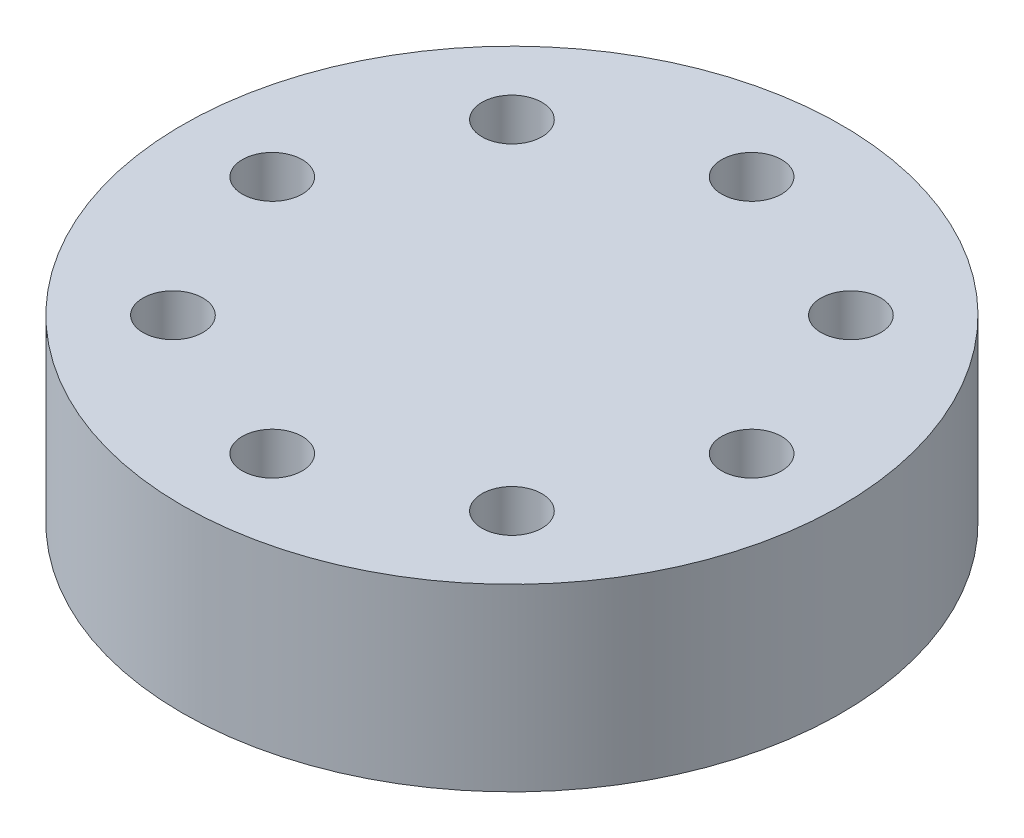
ISO-10303-21;
HEADER;
FILE_DESCRIPTION(('STEP AP214'),'2;1');
FILE_NAME('part.step','',(''),(''),'','','');
FILE_SCHEMA(('AUTOMOTIVE_DESIGN { 1 0 10303 214 1 1 1 1 }'));
ENDSEC;
DATA;
#1=APPLICATION_CONTEXT('core data for automotive mechanical design processes');
#2=APPLICATION_PROTOCOL_DEFINITION('international standard','automotive_design',2000,#1);
#3=PRODUCT_CONTEXT('',#1,'mechanical');
#4=PRODUCT('Part','Part','',(#3));
#5=PRODUCT_RELATED_PRODUCT_CATEGORY('part','',(#4));
#6=PRODUCT_DEFINITION_FORMATION('','',#4);
#7=PRODUCT_DEFINITION_CONTEXT('part definition',#1,'design');
#8=PRODUCT_DEFINITION('design','',#6,#7);
#9=PRODUCT_DEFINITION_SHAPE('','',#8);
#10=(LENGTH_UNIT() NAMED_UNIT(*) SI_UNIT(.MILLI.,.METRE.));
#11=(NAMED_UNIT(*) PLANE_ANGLE_UNIT() SI_UNIT($,.RADIAN.));
#12=(NAMED_UNIT(*) SI_UNIT($,.STERADIAN.) SOLID_ANGLE_UNIT());
#13=UNCERTAINTY_MEASURE_WITH_UNIT(LENGTH_MEASURE(1.E-05),#10,'distance_accuracy_value','');
#14=(GEOMETRIC_REPRESENTATION_CONTEXT(3) GLOBAL_UNCERTAINTY_ASSIGNED_CONTEXT((#13)) GLOBAL_UNIT_ASSIGNED_CONTEXT((#10,
#11,#12)) REPRESENTATION_CONTEXT('',''));
#15=CARTESIAN_POINT('',(0.,0.,0.));
#16=DIRECTION('',(0.,0.,1.));
#17=DIRECTION('',(1.,0.,0.));
#18=AXIS2_PLACEMENT_3D('',#15,#16,#17);
#19=CARTESIAN_POINT('',(0.,6.,0.));
#20=DIRECTION('',(0.,1.,0.));
#21=DIRECTION('',(0.,0.,1.));
#22=AXIS2_PLACEMENT_3D('',#19,#20,#21);
#23=PLANE('',#22);
#24=CARTESIAN_POINT('',(-7.99999999999966,6.,3.40570654445189E-13));
#25=DIRECTION('',(0.,1.,0.));
#26=DIRECTION('',(0.,0.,1.));
#27=AXIS2_PLACEMENT_3D('',#24,#25,#26);
#28=CIRCLE('',#27,1.0000000000005);
#29=CARTESIAN_POINT('',(-7.99999999999966,6.,1.00000000000085));
#30=VERTEX_POINT('',#29);
#31=EDGE_CURVE('E100',#30,#30,#28,.T.);
#32=ORIENTED_EDGE('',*,*,#31,.F.);
#33=EDGE_LOOP('',(#32));
#34=FACE_BOUND('',#33,.T.);
#35=CARTESIAN_POINT('',(6.79181874011743E-13,6.,8.));
#36=DIRECTION('',(0.,1.,0.));
#37=DIRECTION('',(0.,0.,1.));
#38=AXIS2_PLACEMENT_3D('',#35,#36,#37);
#39=CIRCLE('',#38,1.0000000000007);
#40=CARTESIAN_POINT('',(6.79181874011743E-13,6.,9.0000000000007));
#41=VERTEX_POINT('',#40);
#42=EDGE_CURVE('E84',#41,#41,#39,.T.);
#43=ORIENTED_EDGE('',*,*,#42,.F.);
#44=EDGE_LOOP('',(#43));
#45=FACE_BOUND('',#44,.T.);
#46=CARTESIAN_POINT('',(8.00000000000034,6.,-3.39590937005871E-13));
#47=DIRECTION('',(0.,1.,0.));
#48=DIRECTION('',(0.,0.,1.));
#49=AXIS2_PLACEMENT_3D('',#46,#47,#48);
#50=CIRCLE('',#49,1.00000000000025);
#51=CARTESIAN_POINT('',(8.00000000000034,6.,0.999999999999913));
#52=VERTEX_POINT('',#51);
#53=EDGE_CURVE('E68',#52,#52,#50,.T.);
#54=ORIENTED_EDGE('',*,*,#53,.F.);
#55=EDGE_LOOP('',(#54));
#56=FACE_BOUND('',#55,.T.);
#57=CARTESIAN_POINT('',(0.,6.,-8.));
#58=DIRECTION('',(0.,1.,0.));
#59=DIRECTION('',(0.,0.,1.));
#60=AXIS2_PLACEMENT_3D('',#57,#58,#59);
#61=CIRCLE('',#60,1.);
#62=CARTESIAN_POINT('',(0.,6.,-7.));
#63=VERTEX_POINT('',#62);
#64=EDGE_CURVE('E54',#63,#63,#61,.T.);
#65=ORIENTED_EDGE('',*,*,#64,.F.);
#66=EDGE_LOOP('',(#65));
#67=FACE_BOUND('',#66,.T.);
#68=CARTESIAN_POINT('',(0.,6.,0.));
#69=DIRECTION('',(0.,1.,0.));
#70=DIRECTION('',(0.,0.,1.));
#71=AXIS2_PLACEMENT_3D('',#68,#69,#70);
#72=CIRCLE('',#71,11.);
#73=CARTESIAN_POINT('',(0.,6.,11.));
#74=VERTEX_POINT('',#73);
#75=EDGE_CURVE('E10',#74,#74,#72,.T.);
#76=ORIENTED_EDGE('',*,*,#75,.T.);
#77=EDGE_LOOP('',(#76));
#78=FACE_BOUND('',#77,.T.);
#79=CARTESIAN_POINT('',(5.65685424949248,6.,-5.65685424949262));
#80=DIRECTION('',(0.,1.,0.));
#81=DIRECTION('',(0.,0.,1.));
#82=AXIS2_PLACEMENT_3D('',#79,#80,#81);
#83=CIRCLE('',#82,1.00000000000004);
#84=CARTESIAN_POINT('',(5.65685424949248,6.,-4.65685424949258));
#85=VERTEX_POINT('',#84);
#86=EDGE_CURVE('E60',#85,#85,#83,.T.);
#87=ORIENTED_EDGE('',*,*,#86,.F.);
#88=EDGE_LOOP('',(#87));
#89=FACE_BOUND('',#88,.T.);
#90=CARTESIAN_POINT('',(5.65685424949296,6.,5.65685424949214));
#91=DIRECTION('',(0.,1.,0.));
#92=DIRECTION('',(0.,0.,1.));
#93=AXIS2_PLACEMENT_3D('',#90,#91,#92);
#94=CIRCLE('',#93,1.00000000000052);
#95=CARTESIAN_POINT('',(5.65685424949296,6.,6.65685424949266));
#96=VERTEX_POINT('',#95);
#97=EDGE_CURVE('E76',#96,#96,#94,.T.);
#98=ORIENTED_EDGE('',*,*,#97,.F.);
#99=EDGE_LOOP('',(#98));
#100=FACE_BOUND('',#99,.T.);
#101=CARTESIAN_POINT('',(-5.6568542494918,6.,5.65685424949262));
#102=DIRECTION('',(0.,1.,0.));
#103=DIRECTION('',(0.,0.,1.));
#104=AXIS2_PLACEMENT_3D('',#101,#102,#103);
#105=CIRCLE('',#104,1.00000000000069);
#106=CARTESIAN_POINT('',(-5.6568542494918,6.,6.65685424949331));
#107=VERTEX_POINT('',#106);
#108=EDGE_CURVE('E92',#107,#107,#105,.T.);
#109=ORIENTED_EDGE('',*,*,#108,.F.);
#110=EDGE_LOOP('',(#109));
#111=FACE_BOUND('',#110,.T.);
#112=CARTESIAN_POINT('',(-5.65685424949228,6.,-5.65685424949214));
#113=DIRECTION('',(0.,1.,0.));
#114=DIRECTION('',(0.,0.,1.));
#115=AXIS2_PLACEMENT_3D('',#112,#113,#114);
#116=CIRCLE('',#115,1.00000000000026);
#117=CARTESIAN_POINT('',(-5.65685424949228,6.,-4.65685424949188));
#118=VERTEX_POINT('',#117);
#119=EDGE_CURVE('E108',#118,#118,#116,.T.);
#120=ORIENTED_EDGE('',*,*,#119,.F.);
#121=EDGE_LOOP('',(#120));
#122=FACE_BOUND('',#121,.T.);
#123=ADVANCED_FACE('F41',(#34,#45,#56,#67,#78,#89,#100,#111,#122),#23,.T.);
#124=CARTESIAN_POINT('',(0.,0.,0.));
#125=DIRECTION('',(0.,1.,0.));
#126=DIRECTION('',(0.,0.,1.));
#127=AXIS2_PLACEMENT_3D('',#124,#125,#126);
#128=PLANE('',#127);
#129=CARTESIAN_POINT('',(0.,0.,0.));
#130=DIRECTION('',(0.,-1.,0.));
#131=DIRECTION('',(0.,0.,-1.));
#132=AXIS2_PLACEMENT_3D('',#129,#130,#131);
#133=CIRCLE('',#132,4.);
#134=CARTESIAN_POINT('',(0.,0.,-4.));
#135=VERTEX_POINT('',#134);
#136=EDGE_CURVE('E120',#135,#135,#133,.T.);
#137=ORIENTED_EDGE('',*,*,#136,.F.);
#138=EDGE_LOOP('',(#137));
#139=FACE_BOUND('',#138,.T.);
#140=CARTESIAN_POINT('',(0.,0.,0.));
#141=DIRECTION('',(0.,1.,0.));
#142=DIRECTION('',(0.,0.,1.));
#143=AXIS2_PLACEMENT_3D('',#140,#141,#142);
#144=CIRCLE('',#143,11.);
#145=CARTESIAN_POINT('',(0.,0.,11.));
#146=VERTEX_POINT('',#145);
#147=EDGE_CURVE('E45',#146,#146,#144,.T.);
#148=ORIENTED_EDGE('',*,*,#147,.F.);
#149=EDGE_LOOP('',(#148));
#150=FACE_BOUND('',#149,.T.);
#151=CARTESIAN_POINT('',(0.,0.,-8.));
#152=DIRECTION('',(0.,1.,0.));
#153=DIRECTION('',(0.,0.,1.));
#154=AXIS2_PLACEMENT_3D('',#151,#152,#153);
#155=CIRCLE('',#154,1.);
#156=CARTESIAN_POINT('',(0.,0.,-7.));
#157=VERTEX_POINT('',#156);
#158=EDGE_CURVE('E56',#157,#157,#155,.T.);
#159=ORIENTED_EDGE('',*,*,#158,.T.);
#160=EDGE_LOOP('',(#159));
#161=FACE_BOUND('',#160,.T.);
#162=CARTESIAN_POINT('',(5.65685424949248,0.,-5.65685424949262));
#163=DIRECTION('',(0.,1.,0.));
#164=DIRECTION('',(0.,0.,1.));
#165=AXIS2_PLACEMENT_3D('',#162,#163,#164);
#166=CIRCLE('',#165,1.00000000000004);
#167=CARTESIAN_POINT('',(5.65685424949248,0.,-4.65685424949258));
#168=VERTEX_POINT('',#167);
#169=EDGE_CURVE('E64',#168,#168,#166,.T.);
#170=ORIENTED_EDGE('',*,*,#169,.T.);
#171=EDGE_LOOP('',(#170));
#172=FACE_BOUND('',#171,.T.);
#173=CARTESIAN_POINT('',(8.00000000000034,0.,-3.39590937005871E-13));
#174=DIRECTION('',(0.,1.,0.));
#175=DIRECTION('',(0.,0.,1.));
#176=AXIS2_PLACEMENT_3D('',#173,#174,#175);
#177=CIRCLE('',#176,1.00000000000025);
#178=CARTESIAN_POINT('',(8.00000000000034,0.,0.999999999999913));
#179=VERTEX_POINT('',#178);
#180=EDGE_CURVE('E72',#179,#179,#177,.T.);
#181=ORIENTED_EDGE('',*,*,#180,.T.);
#182=EDGE_LOOP('',(#181));
#183=FACE_BOUND('',#182,.T.);
#184=CARTESIAN_POINT('',(5.65685424949296,0.,5.65685424949214));
#185=DIRECTION('',(0.,1.,0.));
#186=DIRECTION('',(0.,0.,1.));
#187=AXIS2_PLACEMENT_3D('',#184,#185,#186);
#188=CIRCLE('',#187,1.00000000000052);
#189=CARTESIAN_POINT('',(5.65685424949296,0.,6.65685424949266));
#190=VERTEX_POINT('',#189);
#191=EDGE_CURVE('E80',#190,#190,#188,.T.);
#192=ORIENTED_EDGE('',*,*,#191,.T.);
#193=EDGE_LOOP('',(#192));
#194=FACE_BOUND('',#193,.T.);
#195=CARTESIAN_POINT('',(6.79181874011743E-13,0.,8.));
#196=DIRECTION('',(0.,1.,0.));
#197=DIRECTION('',(0.,0.,1.));
#198=AXIS2_PLACEMENT_3D('',#195,#196,#197);
#199=CIRCLE('',#198,1.0000000000007);
#200=CARTESIAN_POINT('',(6.79181874011743E-13,0.,9.0000000000007));
#201=VERTEX_POINT('',#200);
#202=EDGE_CURVE('E88',#201,#201,#199,.T.);
#203=ORIENTED_EDGE('',*,*,#202,.T.);
#204=EDGE_LOOP('',(#203));
#205=FACE_BOUND('',#204,.T.);
#206=CARTESIAN_POINT('',(-5.6568542494918,0.,5.65685424949262));
#207=DIRECTION('',(0.,1.,0.));
#208=DIRECTION('',(0.,0.,1.));
#209=AXIS2_PLACEMENT_3D('',#206,#207,#208);
#210=CIRCLE('',#209,1.00000000000069);
#211=CARTESIAN_POINT('',(-5.6568542494918,0.,6.65685424949331));
#212=VERTEX_POINT('',#211);
#213=EDGE_CURVE('E96',#212,#212,#210,.T.);
#214=ORIENTED_EDGE('',*,*,#213,.T.);
#215=EDGE_LOOP('',(#214));
#216=FACE_BOUND('',#215,.T.);
#217=CARTESIAN_POINT('',(-7.99999999999966,0.,3.40570654445189E-13));
#218=DIRECTION('',(0.,1.,0.));
#219=DIRECTION('',(0.,0.,1.));
#220=AXIS2_PLACEMENT_3D('',#217,#218,#219);
#221=CIRCLE('',#220,1.0000000000005);
#222=CARTESIAN_POINT('',(-7.99999999999966,0.,1.00000000000085));
#223=VERTEX_POINT('',#222);
#224=EDGE_CURVE('E104',#223,#223,#221,.T.);
#225=ORIENTED_EDGE('',*,*,#224,.T.);
#226=EDGE_LOOP('',(#225));
#227=FACE_BOUND('',#226,.T.);
#228=CARTESIAN_POINT('',(-5.65685424949228,0.,-5.65685424949214));
#229=DIRECTION('',(0.,1.,0.));
#230=DIRECTION('',(0.,0.,1.));
#231=AXIS2_PLACEMENT_3D('',#228,#229,#230);
#232=CIRCLE('',#231,1.00000000000026);
#233=CARTESIAN_POINT('',(-5.65685424949228,0.,-4.65685424949188));
#234=VERTEX_POINT('',#233);
#235=EDGE_CURVE('E112',#234,#234,#232,.T.);
#236=ORIENTED_EDGE('',*,*,#235,.T.);
#237=EDGE_LOOP('',(#236));
#238=FACE_BOUND('',#237,.T.);
#239=ADVANCED_FACE('F137',(#139,#150,#161,#172,#183,#194,#205,#216,#227,#238),#128,.F.);
#240=CARTESIAN_POINT('',(0.,6.,0.));
#241=DIRECTION('',(0.,-1.,0.));
#242=DIRECTION('',(0.,0.,-1.));
#243=AXIS2_PLACEMENT_3D('',#240,#241,#242);
#244=CYLINDRICAL_SURFACE('',#243,11.);
#245=ORIENTED_EDGE('',*,*,#75,.F.);
#246=EDGE_LOOP('',(#245));
#247=FACE_BOUND('',#246,.T.);
#248=ORIENTED_EDGE('',*,*,#147,.T.);
#249=EDGE_LOOP('',(#248));
#250=FACE_BOUND('',#249,.T.);
#251=ADVANCED_FACE('F43',(#247,#250),#244,.T.);
#252=CARTESIAN_POINT('',(0.,6.,-8.));
#253=DIRECTION('',(0.,-1.,0.));
#254=DIRECTION('',(0.,0.,-1.));
#255=AXIS2_PLACEMENT_3D('',#252,#253,#254);
#256=CYLINDRICAL_SURFACE('',#255,1.);
#257=ORIENTED_EDGE('',*,*,#64,.T.);
#258=EDGE_LOOP('',(#257));
#259=FACE_BOUND('',#258,.T.);
#260=ORIENTED_EDGE('',*,*,#158,.F.);
#261=EDGE_LOOP('',(#260));
#262=FACE_BOUND('',#261,.T.);
#263=ADVANCED_FACE('F176',(#259,#262),#256,.F.);
#264=CARTESIAN_POINT('',(5.65685424949248,6.,-5.65685424949262));
#265=DIRECTION('',(0.,-1.,0.));
#266=DIRECTION('',(0.,0.,-1.));
#267=AXIS2_PLACEMENT_3D('',#264,#265,#266);
#268=CYLINDRICAL_SURFACE('',#267,1.00000000000004);
#269=ORIENTED_EDGE('',*,*,#86,.T.);
#270=EDGE_LOOP('',(#269));
#271=FACE_BOUND('',#270,.T.);
#272=ORIENTED_EDGE('',*,*,#169,.F.);
#273=EDGE_LOOP('',(#272));
#274=FACE_BOUND('',#273,.T.);
#275=ADVANCED_FACE('F179',(#271,#274),#268,.F.);
#276=CARTESIAN_POINT('',(8.00000000000034,6.,-3.39590937005871E-13));
#277=DIRECTION('',(0.,-1.,0.));
#278=DIRECTION('',(0.,0.,-1.));
#279=AXIS2_PLACEMENT_3D('',#276,#277,#278);
#280=CYLINDRICAL_SURFACE('',#279,1.00000000000025);
#281=ORIENTED_EDGE('',*,*,#53,.T.);
#282=EDGE_LOOP('',(#281));
#283=FACE_BOUND('',#282,.T.);
#284=ORIENTED_EDGE('',*,*,#180,.F.);
#285=EDGE_LOOP('',(#284));
#286=FACE_BOUND('',#285,.T.);
#287=ADVANCED_FACE('F183',(#283,#286),#280,.F.);
#288=CARTESIAN_POINT('',(5.65685424949296,6.,5.65685424949214));
#289=DIRECTION('',(0.,-1.,0.));
#290=DIRECTION('',(0.,0.,-1.));
#291=AXIS2_PLACEMENT_3D('',#288,#289,#290);
#292=CYLINDRICAL_SURFACE('',#291,1.00000000000052);
#293=ORIENTED_EDGE('',*,*,#97,.T.);
#294=EDGE_LOOP('',(#293));
#295=FACE_BOUND('',#294,.T.);
#296=ORIENTED_EDGE('',*,*,#191,.F.);
#297=EDGE_LOOP('',(#296));
#298=FACE_BOUND('',#297,.T.);
#299=ADVANCED_FACE('F187',(#295,#298),#292,.F.);
#300=CARTESIAN_POINT('',(6.79181874011743E-13,6.,8.));
#301=DIRECTION('',(0.,-1.,0.));
#302=DIRECTION('',(0.,0.,-1.));
#303=AXIS2_PLACEMENT_3D('',#300,#301,#302);
#304=CYLINDRICAL_SURFACE('',#303,1.0000000000007);
#305=ORIENTED_EDGE('',*,*,#42,.T.);
#306=EDGE_LOOP('',(#305));
#307=FACE_BOUND('',#306,.T.);
#308=ORIENTED_EDGE('',*,*,#202,.F.);
#309=EDGE_LOOP('',(#308));
#310=FACE_BOUND('',#309,.T.);
#311=ADVANCED_FACE('F191',(#307,#310),#304,.F.);
#312=CARTESIAN_POINT('',(-5.6568542494918,6.,5.65685424949262));
#313=DIRECTION('',(0.,-1.,0.));
#314=DIRECTION('',(0.,0.,-1.));
#315=AXIS2_PLACEMENT_3D('',#312,#313,#314);
#316=CYLINDRICAL_SURFACE('',#315,1.00000000000069);
#317=ORIENTED_EDGE('',*,*,#108,.T.);
#318=EDGE_LOOP('',(#317));
#319=FACE_BOUND('',#318,.T.);
#320=ORIENTED_EDGE('',*,*,#213,.F.);
#321=EDGE_LOOP('',(#320));
#322=FACE_BOUND('',#321,.T.);
#323=ADVANCED_FACE('F165',(#319,#322),#316,.F.);
#324=CARTESIAN_POINT('',(-7.99999999999966,6.,3.40570654445189E-13));
#325=DIRECTION('',(0.,-1.,0.));
#326=DIRECTION('',(0.,0.,-1.));
#327=AXIS2_PLACEMENT_3D('',#324,#325,#326);
#328=CYLINDRICAL_SURFACE('',#327,1.0000000000005);
#329=ORIENTED_EDGE('',*,*,#31,.T.);
#330=EDGE_LOOP('',(#329));
#331=FACE_BOUND('',#330,.T.);
#332=ORIENTED_EDGE('',*,*,#224,.F.);
#333=EDGE_LOOP('',(#332));
#334=FACE_BOUND('',#333,.T.);
#335=ADVANCED_FACE('F159',(#331,#334),#328,.F.);
#336=CARTESIAN_POINT('',(-5.65685424949228,6.,-5.65685424949214));
#337=DIRECTION('',(0.,-1.,0.));
#338=DIRECTION('',(0.,0.,-1.));
#339=AXIS2_PLACEMENT_3D('',#336,#337,#338);
#340=CYLINDRICAL_SURFACE('',#339,1.00000000000026);
#341=ORIENTED_EDGE('',*,*,#119,.T.);
#342=EDGE_LOOP('',(#341));
#343=FACE_BOUND('',#342,.T.);
#344=ORIENTED_EDGE('',*,*,#235,.F.);
#345=EDGE_LOOP('',(#344));
#346=FACE_BOUND('',#345,.T.);
#347=ADVANCED_FACE('F133',(#343,#346),#340,.F.);
#348=CARTESIAN_POINT('',(0.,5.5,0.));
#349=DIRECTION('',(0.,-1.,0.));
#350=DIRECTION('',(0.,0.,-1.));
#351=AXIS2_PLACEMENT_3D('',#348,#349,#350);
#352=CYLINDRICAL_SURFACE('',#351,4.);
#353=CARTESIAN_POINT('',(0.,5.5,0.));
#354=DIRECTION('',(0.,-1.,0.));
#355=DIRECTION('',(0.,0.,-1.));
#356=AXIS2_PLACEMENT_3D('',#353,#354,#355);
#357=CIRCLE('',#356,4.);
#358=CARTESIAN_POINT('',(0.,5.5,-4.));
#359=VERTEX_POINT('',#358);
#360=EDGE_CURVE('E116',#359,#359,#357,.T.);
#361=ORIENTED_EDGE('',*,*,#360,.F.);
#362=EDGE_LOOP('',(#361));
#363=FACE_BOUND('',#362,.T.);
#364=ORIENTED_EDGE('',*,*,#136,.T.);
#365=EDGE_LOOP('',(#364));
#366=FACE_BOUND('',#365,.T.);
#367=ADVANCED_FACE('F130',(#363,#366),#352,.F.);
#368=CARTESIAN_POINT('',(0.,5.5,0.));
#369=DIRECTION('',(0.,-1.,0.));
#370=DIRECTION('',(0.,0.,-1.));
#371=AXIS2_PLACEMENT_3D('',#368,#369,#370);
#372=PLANE('',#371);
#373=ORIENTED_EDGE('',*,*,#360,.T.);
#374=EDGE_LOOP('',(#373));
#375=FACE_BOUND('',#374,.T.);
#376=ADVANCED_FACE('F128',(#375),#372,.T.);
#377=CLOSED_SHELL('',(#123,#239,#251,#263,#275,#287,#299,#311,#323,#335,#347,#367,#376));
#378=MANIFOLD_SOLID_BREP('B2',#377);
#379=ADVANCED_BREP_SHAPE_REPRESENTATION('',(#18,#378),#14);
#380=SHAPE_DEFINITION_REPRESENTATION(#9,#379);
ENDSEC;
END-ISO-10303-21;
